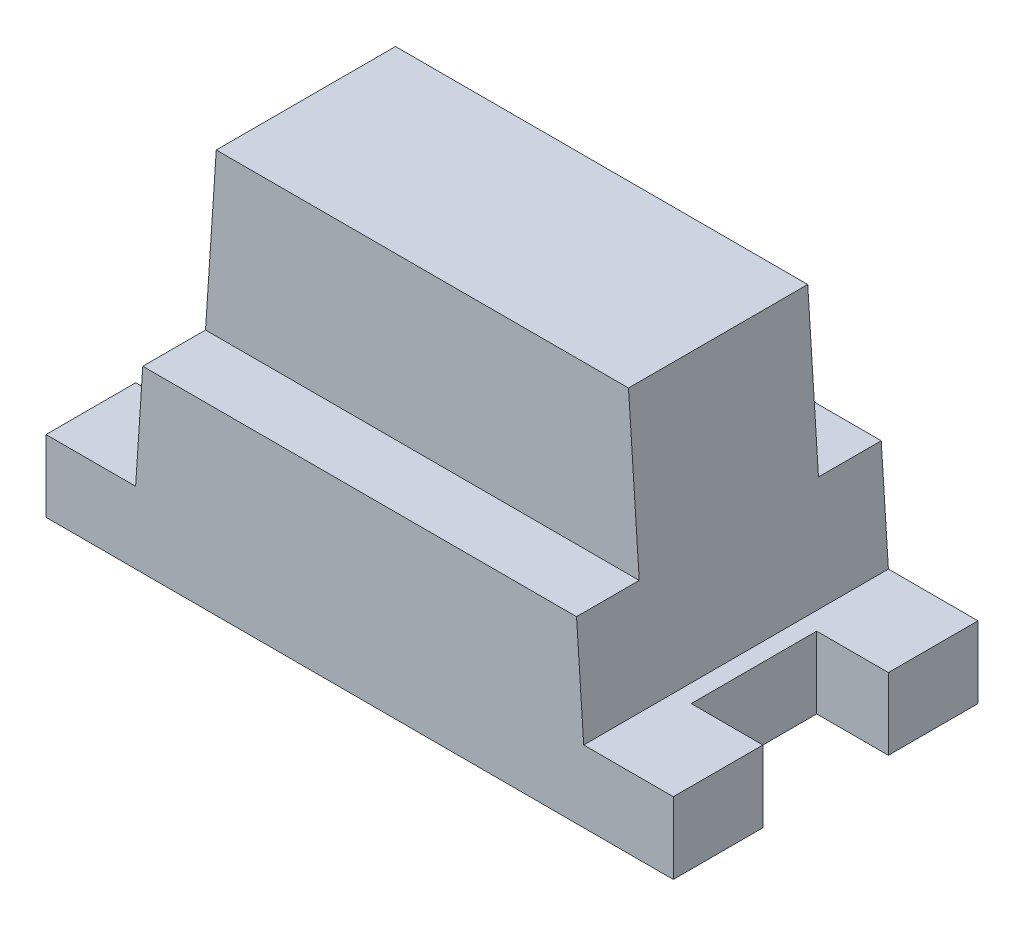
ISO-10303-21;
HEADER;
FILE_DESCRIPTION(('STEP AP214'),'2;1');
FILE_NAME('part.step','',(''),(''),'','','');
FILE_SCHEMA(('AUTOMOTIVE_DESIGN { 1 0 10303 214 1 1 1 1 }'));
ENDSEC;
DATA;
#1=APPLICATION_CONTEXT('core data for automotive mechanical design processes');
#2=APPLICATION_PROTOCOL_DEFINITION('international standard','automotive_design',2000,#1);
#3=PRODUCT_CONTEXT('',#1,'mechanical');
#4=PRODUCT('Part','Part','',(#3));
#5=PRODUCT_RELATED_PRODUCT_CATEGORY('part','',(#4));
#6=PRODUCT_DEFINITION_FORMATION('','',#4);
#7=PRODUCT_DEFINITION_CONTEXT('part definition',#1,'design');
#8=PRODUCT_DEFINITION('design','',#6,#7);
#9=PRODUCT_DEFINITION_SHAPE('','',#8);
#10=(LENGTH_UNIT() NAMED_UNIT(*) SI_UNIT(.MILLI.,.METRE.));
#11=(NAMED_UNIT(*) PLANE_ANGLE_UNIT() SI_UNIT($,.RADIAN.));
#12=(NAMED_UNIT(*) SI_UNIT($,.STERADIAN.) SOLID_ANGLE_UNIT());
#13=UNCERTAINTY_MEASURE_WITH_UNIT(LENGTH_MEASURE(1.E-05),#10,'distance_accuracy_value','');
#14=(GEOMETRIC_REPRESENTATION_CONTEXT(3) GLOBAL_UNCERTAINTY_ASSIGNED_CONTEXT((#13)) GLOBAL_UNIT_ASSIGNED_CONTEXT((#10,
#11,#12)) REPRESENTATION_CONTEXT('',''));
#15=CARTESIAN_POINT('',(0.,0.,0.));
#16=DIRECTION('',(0.,0.,1.));
#17=DIRECTION('',(1.,0.,0.));
#18=AXIS2_PLACEMENT_3D('',#15,#16,#17);
#19=CARTESIAN_POINT('',(-48.6631265428452,0.,-17.));
#20=DIRECTION('',(1.,0.,0.));
#21=DIRECTION('',(0.,1.,0.));
#22=AXIS2_PLACEMENT_3D('',#19,#20,#21);
#23=PLANE('',#22);
#24=DIRECTION('',(0.,0.,1.));
#25=VECTOR('',#24,1.);
#26=CARTESIAN_POINT('',(-48.6631265428453,-30.6823675718026,-17.));
#27=LINE('',#26,#25);
#28=CARTESIAN_POINT('',(-48.6631265428453,-30.6823675718026,-17.));
#29=VERTEX_POINT('',#28);
#30=CARTESIAN_POINT('',(-48.6631265428453,-30.6823675718026,-7.));
#31=VERTEX_POINT('',#30);
#32=EDGE_CURVE('E11',#29,#31,#27,.T.);
#33=ORIENTED_EDGE('',*,*,#32,.T.);
#34=DIRECTION('',(0.,-1.,0.));
#35=VECTOR('',#34,1.);
#36=CARTESIAN_POINT('',(-48.6631265428453,-22.6823675718026,-7.));
#37=LINE('',#36,#35);
#38=CARTESIAN_POINT('',(-48.6631265428453,-22.6823675718026,-7.));
#39=VERTEX_POINT('',#38);
#40=EDGE_CURVE('E186',#39,#31,#37,.T.);
#41=ORIENTED_EDGE('',*,*,#40,.F.);
#42=DIRECTION('',(0.,0.,1.));
#43=VECTOR('',#42,1.);
#44=CARTESIAN_POINT('',(-48.6631265428453,-22.6823675718026,-17.));
#45=LINE('',#44,#43);
#46=CARTESIAN_POINT('',(-48.6631265428453,-22.6823675718026,-17.));
#47=VERTEX_POINT('',#46);
#48=EDGE_CURVE('E355',#47,#39,#45,.T.);
#49=ORIENTED_EDGE('',*,*,#48,.F.);
#50=DIRECTION('',(0.,1.,0.));
#51=VECTOR('',#50,1.);
#52=CARTESIAN_POINT('',(-48.6631265428452,0.,-17.));
#53=LINE('',#52,#51);
#54=EDGE_CURVE('E351',#29,#47,#53,.T.);
#55=ORIENTED_EDGE('',*,*,#54,.F.);
#56=EDGE_LOOP('',(#33,#41,#49,#55));
#57=FACE_BOUND('',#56,.T.);
#58=ADVANCED_FACE('F41',(#57),#23,.F.);
#59=CARTESIAN_POINT('',(21.3368734571547,0.,-17.));
#60=DIRECTION('',(1.,0.,0.));
#61=DIRECTION('',(0.,0.,-1.));
#62=AXIS2_PLACEMENT_3D('',#59,#60,#61);
#63=PLANE('',#62);
#64=DIRECTION('',(0.,-1.,0.));
#65=VECTOR('',#64,1.);
#66=CARTESIAN_POINT('',(21.3368734571547,-30.6823675718026,7.));
#67=LINE('',#66,#65);
#68=CARTESIAN_POINT('',(21.3368734571547,-22.6823675718026,7.));
#69=VERTEX_POINT('',#68);
#70=CARTESIAN_POINT('',(21.3368734571547,-30.6823675718026,7.));
#71=VERTEX_POINT('',#70);
#72=EDGE_CURVE('E216',#69,#71,#67,.T.);
#73=ORIENTED_EDGE('',*,*,#72,.F.);
#74=DIRECTION('',(0.,0.,1.));
#75=VECTOR('',#74,1.);
#76=CARTESIAN_POINT('',(21.3368734571547,-22.6823675718026,-17.));
#77=LINE('',#76,#75);
#78=CARTESIAN_POINT('',(21.3368734571547,-22.6823675718026,17.));
#79=VERTEX_POINT('',#78);
#80=EDGE_CURVE('E378',#69,#79,#77,.T.);
#81=ORIENTED_EDGE('',*,*,#80,.T.);
#82=DIRECTION('',(0.,1.,0.));
#83=VECTOR('',#82,1.);
#84=CARTESIAN_POINT('',(21.3368734571547,0.,17.));
#85=LINE('',#84,#83);
#86=CARTESIAN_POINT('',(21.3368734571547,-30.6823675718026,17.));
#87=VERTEX_POINT('',#86);
#88=EDGE_CURVE('E297',#87,#79,#85,.T.);
#89=ORIENTED_EDGE('',*,*,#88,.F.);
#90=DIRECTION('',(0.,0.,1.));
#91=VECTOR('',#90,1.);
#92=CARTESIAN_POINT('',(21.3368734571547,-30.6823675718026,-17.));
#93=LINE('',#92,#91);
#94=EDGE_CURVE('E353',#71,#87,#93,.T.);
#95=ORIENTED_EDGE('',*,*,#94,.F.);
#96=EDGE_LOOP('',(#73,#81,#89,#95));
#97=FACE_BOUND('',#96,.T.);
#98=ADVANCED_FACE('F392',(#97),#63,.T.);
#99=CARTESIAN_POINT('',(0.,-10.6823675718026,-17.));
#100=DIRECTION('',(0.,-1.,0.));
#101=DIRECTION('',(0.,0.,-1.));
#102=AXIS2_PLACEMENT_3D('',#99,#100,#101);
#103=PLANE('',#102);
#104=DIRECTION('',(1.,0.,0.));
#105=VECTOR('',#104,1.);
#106=CARTESIAN_POINT('',(0.,-10.6823675718026,10.));
#107=LINE('',#106,#105);
#108=CARTESIAN_POINT('',(-37.8631265428453,-10.6823675718026,10.));
#109=VERTEX_POINT('',#108);
#110=CARTESIAN_POINT('',(10.5368734571547,-10.6823675718026,10.));
#111=VERTEX_POINT('',#110);
#112=EDGE_CURVE('E261',#109,#111,#107,.T.);
#113=ORIENTED_EDGE('',*,*,#112,.F.);
#114=DIRECTION('',(0.,0.,1.));
#115=VECTOR('',#114,1.);
#116=CARTESIAN_POINT('',(-37.8631265428453,-10.6823675718026,-17.));
#117=LINE('',#116,#115);
#118=CARTESIAN_POINT('',(-37.8631265428453,-10.6823675718026,17.));
#119=VERTEX_POINT('',#118);
#120=EDGE_CURVE('E367',#109,#119,#117,.T.);
#121=ORIENTED_EDGE('',*,*,#120,.T.);
#122=DIRECTION('',(1.,0.,0.));
#123=VECTOR('',#122,1.);
#124=CARTESIAN_POINT('',(0.,-10.6823675718026,17.));
#125=LINE('',#124,#123);
#126=CARTESIAN_POINT('',(10.5368734571547,-10.6823675718026,17.));
#127=VERTEX_POINT('',#126);
#128=EDGE_CURVE('E309',#119,#127,#125,.T.);
#129=ORIENTED_EDGE('',*,*,#128,.T.);
#130=DIRECTION('',(0.,0.,1.));
#131=VECTOR('',#130,1.);
#132=CARTESIAN_POINT('',(10.5368734571547,-10.6823675718026,-17.));
#133=LINE('',#132,#131);
#134=EDGE_CURVE('E372',#111,#127,#133,.T.);
#135=ORIENTED_EDGE('',*,*,#134,.F.);
#136=EDGE_LOOP('',(#113,#121,#129,#135));
#137=FACE_BOUND('',#136,.T.);
#138=ADVANCED_FACE('F414',(#137),#103,.F.);
#139=CARTESIAN_POINT('',(0.,-30.6823675718026,-17.));
#140=DIRECTION('',(0.,-1.,0.));
#141=DIRECTION('',(0.,0.,-1.));
#142=AXIS2_PLACEMENT_3D('',#139,#140,#141);
#143=PLANE('',#142);
#144=DIRECTION('',(-1.,0.,0.));
#145=VECTOR('',#144,1.);
#146=CARTESIAN_POINT('',(-40.6631265428453,-30.6823675718026,-7.));
#147=LINE('',#146,#145);
#148=CARTESIAN_POINT('',(-40.6631265428453,-30.6823675718026,-7.));
#149=VERTEX_POINT('',#148);
#150=EDGE_CURVE('E181',#149,#31,#147,.T.);
#151=ORIENTED_EDGE('',*,*,#150,.T.);
#152=ORIENTED_EDGE('',*,*,#32,.F.);
#153=DIRECTION('',(1.,0.,0.));
#154=VECTOR('',#153,1.);
#155=CARTESIAN_POINT('',(0.,-30.6823675718026,-17.));
#156=LINE('',#155,#154);
#157=CARTESIAN_POINT('',(21.3368734571547,-30.6823675718026,-17.));
#158=VERTEX_POINT('',#157);
#159=EDGE_CURVE('E325',#29,#158,#156,.T.);
#160=ORIENTED_EDGE('',*,*,#159,.T.);
#161=CARTESIAN_POINT('',(21.3368734571547,-30.6823675718026,-7.));
#162=VERTEX_POINT('',#161);
#163=EDGE_CURVE('E45',#158,#162,#93,.T.);
#164=ORIENTED_EDGE('',*,*,#163,.T.);
#165=DIRECTION('',(1.,0.,0.));
#166=VECTOR('',#165,1.);
#167=CARTESIAN_POINT('',(13.3368734571547,-30.6823675718026,-7.));
#168=LINE('',#167,#166);
#169=CARTESIAN_POINT('',(13.3368734571547,-30.6823675718026,-7.));
#170=VERTEX_POINT('',#169);
#171=EDGE_CURVE('E67',#170,#162,#168,.T.);
#172=ORIENTED_EDGE('',*,*,#171,.F.);
#173=DIRECTION('',(0.,0.,-1.));
#174=VECTOR('',#173,1.);
#175=CARTESIAN_POINT('',(13.3368734571547,-30.6823675718026,7.));
#176=LINE('',#175,#174);
#177=CARTESIAN_POINT('',(13.3368734571547,-30.6823675718026,7.));
#178=VERTEX_POINT('',#177);
#179=EDGE_CURVE('E227',#178,#170,#176,.T.);
#180=ORIENTED_EDGE('',*,*,#179,.F.);
#181=DIRECTION('',(1.,0.,0.));
#182=VECTOR('',#181,1.);
#183=CARTESIAN_POINT('',(13.3368734571547,-30.6823675718026,7.));
#184=LINE('',#183,#182);
#185=EDGE_CURVE('E240',#178,#71,#184,.T.);
#186=ORIENTED_EDGE('',*,*,#185,.T.);
#187=ORIENTED_EDGE('',*,*,#94,.T.);
#188=DIRECTION('',(1.,0.,0.));
#189=VECTOR('',#188,1.);
#190=CARTESIAN_POINT('',(0.,-30.6823675718026,17.));
#191=LINE('',#190,#189);
#192=CARTESIAN_POINT('',(-48.6631265428453,-30.6823675718026,17.));
#193=VERTEX_POINT('',#192);
#194=EDGE_CURVE('E291',#193,#87,#191,.T.);
#195=ORIENTED_EDGE('',*,*,#194,.F.);
#196=CARTESIAN_POINT('',(-48.6631265428453,-30.6823675718026,7.));
#197=VERTEX_POINT('',#196);
#198=EDGE_CURVE('E51',#197,#193,#27,.T.);
#199=ORIENTED_EDGE('',*,*,#198,.F.);
#200=DIRECTION('',(-1.,0.,0.));
#201=VECTOR('',#200,1.);
#202=CARTESIAN_POINT('',(-40.6631265428453,-30.6823675718026,7.));
#203=LINE('',#202,#201);
#204=CARTESIAN_POINT('',(-40.6631265428453,-30.6823675718026,7.));
#205=VERTEX_POINT('',#204);
#206=EDGE_CURVE('E190',#205,#197,#203,.T.);
#207=ORIENTED_EDGE('',*,*,#206,.F.);
#208=DIRECTION('',(0.,0.,1.));
#209=VECTOR('',#208,1.);
#210=CARTESIAN_POINT('',(-40.6631265428453,-30.6823675718026,-7.));
#211=LINE('',#210,#209);
#212=EDGE_CURVE('E194',#149,#205,#211,.T.);
#213=ORIENTED_EDGE('',*,*,#212,.F.);
#214=EDGE_LOOP('',(#151,#152,#160,#164,#172,#180,#186,#187,#195,#199,#207,#213));
#215=FACE_BOUND('',#214,.T.);
#216=ADVANCED_FACE('F43',(#215),#143,.T.);
#217=CARTESIAN_POINT('',(-48.6631265428453,-22.6823675718026,7.));
#218=VERTEX_POINT('',#217);
#219=CARTESIAN_POINT('',(-48.6631265428453,-22.6823675718026,17.));
#220=VERTEX_POINT('',#219);
#221=EDGE_CURVE('E359',#218,#220,#45,.T.);
#222=ORIENTED_EDGE('',*,*,#221,.F.);
#223=DIRECTION('',(0.,1.,0.));
#224=VECTOR('',#223,1.);
#225=CARTESIAN_POINT('',(-48.6631265428453,-22.6823675718026,7.));
#226=LINE('',#225,#224);
#227=EDGE_CURVE('E199',#197,#218,#226,.T.);
#228=ORIENTED_EDGE('',*,*,#227,.F.);
#229=ORIENTED_EDGE('',*,*,#198,.T.);
#230=DIRECTION('',(0.,1.,0.));
#231=VECTOR('',#230,1.);
#232=CARTESIAN_POINT('',(-48.6631265428452,0.,17.));
#233=LINE('',#232,#231);
#234=EDGE_CURVE('E321',#193,#220,#233,.T.);
#235=ORIENTED_EDGE('',*,*,#234,.T.);
#236=EDGE_LOOP('',(#222,#228,#229,#235));
#237=FACE_BOUND('',#236,.T.);
#238=ADVANCED_FACE('F400',(#237),#23,.F.);
#239=CARTESIAN_POINT('',(0.,-22.6823675718026,-17.));
#240=DIRECTION('',(0.,1.,0.));
#241=DIRECTION('',(0.,0.,1.));
#242=AXIS2_PLACEMENT_3D('',#239,#240,#241);
#243=PLANE('',#242);
#244=DIRECTION('',(-1.,0.,0.));
#245=VECTOR('',#244,1.);
#246=CARTESIAN_POINT('',(-40.6631265428453,-22.6823675718026,-7.));
#247=LINE('',#246,#245);
#248=CARTESIAN_POINT('',(-40.6631265428453,-22.6823675718026,-7.));
#249=VERTEX_POINT('',#248);
#250=EDGE_CURVE('E213',#249,#39,#247,.T.);
#251=ORIENTED_EDGE('',*,*,#250,.F.);
#252=DIRECTION('',(0.,0.,-1.));
#253=VECTOR('',#252,1.);
#254=CARTESIAN_POINT('',(-40.6631265428453,-22.6823675718026,-7.));
#255=LINE('',#254,#253);
#256=CARTESIAN_POINT('',(-40.6631265428453,-22.6823675718026,7.));
#257=VERTEX_POINT('',#256);
#258=EDGE_CURVE('E191',#257,#249,#255,.T.);
#259=ORIENTED_EDGE('',*,*,#258,.F.);
#260=DIRECTION('',(-1.,0.,0.));
#261=VECTOR('',#260,1.);
#262=CARTESIAN_POINT('',(-40.6631265428453,-22.6823675718026,7.));
#263=LINE('',#262,#261);
#264=EDGE_CURVE('E217',#257,#218,#263,.T.);
#265=ORIENTED_EDGE('',*,*,#264,.T.);
#266=ORIENTED_EDGE('',*,*,#221,.T.);
#267=DIRECTION('',(-1.,0.,0.));
#268=VECTOR('',#267,1.);
#269=CARTESIAN_POINT('',(0.,-22.6823675718026,17.));
#270=LINE('',#269,#268);
#271=CARTESIAN_POINT('',(-38.6631265428453,-22.6823675718026,17.));
#272=VERTEX_POINT('',#271);
#273=EDGE_CURVE('E317',#272,#220,#270,.T.);
#274=ORIENTED_EDGE('',*,*,#273,.F.);
#275=DIRECTION('',(0.,0.,1.));
#276=VECTOR('',#275,1.);
#277=CARTESIAN_POINT('',(-38.6631265428453,-22.6823675718026,-17.));
#278=LINE('',#277,#276);
#279=CARTESIAN_POINT('',(-38.6631265428453,-22.6823675718026,-17.));
#280=VERTEX_POINT('',#279);
#281=EDGE_CURVE('E360',#280,#272,#278,.T.);
#282=ORIENTED_EDGE('',*,*,#281,.F.);
#283=DIRECTION('',(-1.,0.,0.));
#284=VECTOR('',#283,1.);
#285=CARTESIAN_POINT('',(0.,-22.6823675718026,-17.));
#286=LINE('',#285,#284);
#287=EDGE_CURVE('E347',#280,#47,#286,.T.);
#288=ORIENTED_EDGE('',*,*,#287,.T.);
#289=ORIENTED_EDGE('',*,*,#48,.T.);
#290=EDGE_LOOP('',(#251,#259,#265,#266,#274,#282,#288,#289));
#291=FACE_BOUND('',#290,.T.);
#292=ADVANCED_FACE('F424',(#291),#243,.T.);
#293=CARTESIAN_POINT('',(-36.9865838874476,2.46577225916316,-17.));
#294=DIRECTION('',(0.997785157856609,-0.0665190105237735,0.));
#295=DIRECTION('',(0.0665190105237735,0.997785157856609,0.));
#296=AXIS2_PLACEMENT_3D('',#293,#294,#295);
#297=PLANE('',#296);
#298=ORIENTED_EDGE('',*,*,#281,.T.);
#299=DIRECTION('',(0.0665190105237735,0.997785157856609,0.));
#300=VECTOR('',#299,1.);
#301=CARTESIAN_POINT('',(-36.9865838874476,2.46577225916316,17.));
#302=LINE('',#301,#300);
#303=EDGE_CURVE('E313',#272,#119,#302,.T.);
#304=ORIENTED_EDGE('',*,*,#303,.T.);
#305=ORIENTED_EDGE('',*,*,#120,.F.);
#306=DIRECTION('',(0.0665190105237735,0.997785157856609,0.));
#307=VECTOR('',#306,1.);
#308=CARTESIAN_POINT('',(-36.9865838874476,2.46577225916316,10.));
#309=LINE('',#308,#307);
#310=CARTESIAN_POINT('',(-36.6631265428453,7.31763242819744,10.));
#311=VERTEX_POINT('',#310);
#312=EDGE_CURVE('E248',#109,#311,#309,.T.);
#313=ORIENTED_EDGE('',*,*,#312,.T.);
#314=DIRECTION('',(0.,0.,1.));
#315=VECTOR('',#314,1.);
#316=CARTESIAN_POINT('',(-36.6631265428453,7.31763242819744,-10.));
#317=LINE('',#316,#315);
#318=CARTESIAN_POINT('',(-36.6631265428453,7.31763242819744,-10.));
#319=VERTEX_POINT('',#318);
#320=EDGE_CURVE('E288',#319,#311,#317,.T.);
#321=ORIENTED_EDGE('',*,*,#320,.F.);
#322=DIRECTION('',(0.0665190105237735,0.997785157856609,0.));
#323=VECTOR('',#322,1.);
#324=CARTESIAN_POINT('',(-36.9865838874476,2.46577225916316,-10.));
#325=LINE('',#324,#323);
#326=CARTESIAN_POINT('',(-37.8631265428453,-10.6823675718026,-10.));
#327=VERTEX_POINT('',#326);
#328=EDGE_CURVE('E272',#327,#319,#325,.T.);
#329=ORIENTED_EDGE('',*,*,#328,.F.);
#330=CARTESIAN_POINT('',(-37.8631265428453,-10.6823675718026,-17.));
#331=VERTEX_POINT('',#330);
#332=EDGE_CURVE('E363',#331,#327,#117,.T.);
#333=ORIENTED_EDGE('',*,*,#332,.F.);
#334=DIRECTION('',(0.0665190105237735,0.997785157856609,0.));
#335=VECTOR('',#334,1.);
#336=CARTESIAN_POINT('',(-36.9865838874476,2.46577225916316,-17.));
#337=LINE('',#336,#335);
#338=EDGE_CURVE('E344',#280,#331,#337,.T.);
#339=ORIENTED_EDGE('',*,*,#338,.F.);
#340=EDGE_LOOP('',(#298,#304,#305,#313,#321,#329,#333,#339));
#341=FACE_BOUND('',#340,.T.);
#342=ADVANCED_FACE('F417',(#341),#297,.F.);
#343=ORIENTED_EDGE('',*,*,#332,.T.);
#344=DIRECTION('',(1.,0.,0.));
#345=VECTOR('',#344,1.);
#346=CARTESIAN_POINT('',(0.,-10.6823675718026,-10.));
#347=LINE('',#346,#345);
#348=CARTESIAN_POINT('',(10.5368734571547,-10.6823675718026,-10.));
#349=VERTEX_POINT('',#348);
#350=EDGE_CURVE('E276',#327,#349,#347,.T.);
#351=ORIENTED_EDGE('',*,*,#350,.T.);
#352=CARTESIAN_POINT('',(10.5368734571547,-10.6823675718026,-17.));
#353=VERTEX_POINT('',#352);
#354=EDGE_CURVE('E368',#353,#349,#133,.T.);
#355=ORIENTED_EDGE('',*,*,#354,.F.);
#356=DIRECTION('',(1.,0.,0.));
#357=VECTOR('',#356,1.);
#358=CARTESIAN_POINT('',(0.,-10.6823675718026,-17.));
#359=LINE('',#358,#357);
#360=EDGE_CURVE('E341',#331,#353,#359,.T.);
#361=ORIENTED_EDGE('',*,*,#360,.F.);
#362=EDGE_LOOP('',(#343,#351,#355,#361));
#363=FACE_BOUND('',#362,.T.);
#364=ADVANCED_FACE('F454',(#363),#103,.F.);
#365=CARTESIAN_POINT('',(9.78124342602997,0.65208289506867,-17.));
#366=DIRECTION('',(0.997785157856609,0.0665190105237744,0.));
#367=DIRECTION('',(-0.0665190105237744,0.997785157856609,0.));
#368=AXIS2_PLACEMENT_3D('',#365,#366,#367);
#369=PLANE('',#368);
#370=ORIENTED_EDGE('',*,*,#354,.T.);
#371=DIRECTION('',(-0.0665190105237744,0.997785157856609,0.));
#372=VECTOR('',#371,1.);
#373=CARTESIAN_POINT('',(9.78124342602997,0.65208289506867,-10.));
#374=LINE('',#373,#372);
#375=CARTESIAN_POINT('',(9.33687345715472,7.31763242819744,-10.));
#376=VERTEX_POINT('',#375);
#377=EDGE_CURVE('E280',#349,#376,#374,.T.);
#378=ORIENTED_EDGE('',*,*,#377,.T.);
#379=DIRECTION('',(0.,0.,1.));
#380=VECTOR('',#379,1.);
#381=CARTESIAN_POINT('',(9.33687345715472,7.31763242819744,-10.));
#382=LINE('',#381,#380);
#383=CARTESIAN_POINT('',(9.33687345715472,7.31763242819744,10.));
#384=VERTEX_POINT('',#383);
#385=EDGE_CURVE('E287',#376,#384,#382,.T.);
#386=ORIENTED_EDGE('',*,*,#385,.T.);
#387=DIRECTION('',(-0.0665190105237744,0.997785157856609,0.));
#388=VECTOR('',#387,1.);
#389=CARTESIAN_POINT('',(9.78124342602997,0.65208289506867,10.));
#390=LINE('',#389,#388);
#391=EDGE_CURVE('E264',#111,#384,#390,.T.);
#392=ORIENTED_EDGE('',*,*,#391,.F.);
#393=ORIENTED_EDGE('',*,*,#134,.T.);
#394=DIRECTION('',(-0.0665190105237744,0.997785157856609,0.));
#395=VECTOR('',#394,1.);
#396=CARTESIAN_POINT('',(9.78124342602997,0.65208289506867,17.));
#397=LINE('',#396,#395);
#398=CARTESIAN_POINT('',(11.3368734571547,-22.6823675718026,17.));
#399=VERTEX_POINT('',#398);
#400=EDGE_CURVE('E305',#399,#127,#397,.T.);
#401=ORIENTED_EDGE('',*,*,#400,.F.);
#402=DIRECTION('',(0.,0.,1.));
#403=VECTOR('',#402,1.);
#404=CARTESIAN_POINT('',(11.3368734571547,-22.6823675718026,-17.));
#405=LINE('',#404,#403);
#406=CARTESIAN_POINT('',(11.3368734571547,-22.6823675718026,-17.));
#407=VERTEX_POINT('',#406);
#408=EDGE_CURVE('E373',#407,#399,#405,.T.);
#409=ORIENTED_EDGE('',*,*,#408,.F.);
#410=DIRECTION('',(-0.0665190105237744,0.997785157856609,0.));
#411=VECTOR('',#410,1.);
#412=CARTESIAN_POINT('',(9.78124342602997,0.65208289506867,-17.));
#413=LINE('',#412,#411);
#414=EDGE_CURVE('E337',#407,#353,#413,.T.);
#415=ORIENTED_EDGE('',*,*,#414,.T.);
#416=EDGE_LOOP('',(#370,#378,#386,#392,#393,#401,#409,#415));
#417=FACE_BOUND('',#416,.T.);
#418=ADVANCED_FACE('F410',(#417),#369,.T.);
#419=CARTESIAN_POINT('',(0.,-22.6823675718026,-17.));
#420=DIRECTION('',(0.,1.,0.));
#421=DIRECTION('',(0.,0.,1.));
#422=AXIS2_PLACEMENT_3D('',#419,#420,#421);
#423=PLANE('',#422);
#424=DIRECTION('',(1.,0.,0.));
#425=VECTOR('',#424,1.);
#426=CARTESIAN_POINT('',(13.3368734571547,-22.6823675718026,7.));
#427=LINE('',#426,#425);
#428=CARTESIAN_POINT('',(13.3368734571547,-22.6823675718026,7.));
#429=VERTEX_POINT('',#428);
#430=EDGE_CURVE('E245',#429,#69,#427,.T.);
#431=ORIENTED_EDGE('',*,*,#430,.F.);
#432=DIRECTION('',(0.,0.,1.));
#433=VECTOR('',#432,1.);
#434=CARTESIAN_POINT('',(13.3368734571547,-22.6823675718026,7.));
#435=LINE('',#434,#433);
#436=CARTESIAN_POINT('',(13.3368734571547,-22.6823675718026,-7.));
#437=VERTEX_POINT('',#436);
#438=EDGE_CURVE('E236',#437,#429,#435,.T.);
#439=ORIENTED_EDGE('',*,*,#438,.F.);
#440=DIRECTION('',(1.,0.,0.));
#441=VECTOR('',#440,1.);
#442=CARTESIAN_POINT('',(13.3368734571547,-22.6823675718026,-7.));
#443=LINE('',#442,#441);
#444=CARTESIAN_POINT('',(21.3368734571547,-22.6823675718026,-7.));
#445=VERTEX_POINT('',#444);
#446=EDGE_CURVE('E249',#437,#445,#443,.T.);
#447=ORIENTED_EDGE('',*,*,#446,.T.);
#448=CARTESIAN_POINT('',(21.3368734571547,-22.6823675718026,-17.));
#449=VERTEX_POINT('',#448);
#450=EDGE_CURVE('E375',#449,#445,#77,.T.);
#451=ORIENTED_EDGE('',*,*,#450,.F.);
#452=DIRECTION('',(-1.,0.,0.));
#453=VECTOR('',#452,1.);
#454=CARTESIAN_POINT('',(0.,-22.6823675718026,-17.));
#455=LINE('',#454,#453);
#456=EDGE_CURVE('E333',#449,#407,#455,.T.);
#457=ORIENTED_EDGE('',*,*,#456,.T.);
#458=ORIENTED_EDGE('',*,*,#408,.T.);
#459=DIRECTION('',(-1.,0.,0.));
#460=VECTOR('',#459,1.);
#461=CARTESIAN_POINT('',(0.,-22.6823675718026,17.));
#462=LINE('',#461,#460);
#463=EDGE_CURVE('E301',#79,#399,#462,.T.);
#464=ORIENTED_EDGE('',*,*,#463,.F.);
#465=ORIENTED_EDGE('',*,*,#80,.F.);
#466=EDGE_LOOP('',(#431,#439,#447,#451,#457,#458,#464,#465));
#467=FACE_BOUND('',#466,.T.);
#468=ADVANCED_FACE('F465',(#467),#423,.T.);
#469=DIRECTION('',(0.,1.,0.));
#470=VECTOR('',#469,1.);
#471=CARTESIAN_POINT('',(21.3368734571547,-30.6823675718026,-7.));
#472=LINE('',#471,#470);
#473=EDGE_CURVE('E228',#162,#445,#472,.T.);
#474=ORIENTED_EDGE('',*,*,#473,.F.);
#475=ORIENTED_EDGE('',*,*,#163,.F.);
#476=DIRECTION('',(0.,1.,0.));
#477=VECTOR('',#476,1.);
#478=CARTESIAN_POINT('',(21.3368734571547,0.,-17.));
#479=LINE('',#478,#477);
#480=EDGE_CURVE('E329',#158,#449,#479,.T.);
#481=ORIENTED_EDGE('',*,*,#480,.T.);
#482=ORIENTED_EDGE('',*,*,#450,.T.);
#483=EDGE_LOOP('',(#474,#475,#481,#482));
#484=FACE_BOUND('',#483,.T.);
#485=ADVANCED_FACE('F442',(#484),#63,.T.);
#486=CARTESIAN_POINT('',(0.,0.,-17.));
#487=DIRECTION('',(0.,0.,1.));
#488=DIRECTION('',(1.,0.,0.));
#489=AXIS2_PLACEMENT_3D('',#486,#487,#488);
#490=PLANE('',#489);
#491=ORIENTED_EDGE('',*,*,#159,.F.);
#492=ORIENTED_EDGE('',*,*,#54,.T.);
#493=ORIENTED_EDGE('',*,*,#287,.F.);
#494=ORIENTED_EDGE('',*,*,#338,.T.);
#495=ORIENTED_EDGE('',*,*,#360,.T.);
#496=ORIENTED_EDGE('',*,*,#414,.F.);
#497=ORIENTED_EDGE('',*,*,#456,.F.);
#498=ORIENTED_EDGE('',*,*,#480,.F.);
#499=EDGE_LOOP('',(#491,#492,#493,#494,#495,#496,#497,#498));
#500=FACE_BOUND('',#499,.T.);
#501=ADVANCED_FACE('F476',(#500),#490,.F.);
#502=CARTESIAN_POINT('',(0.,0.,17.));
#503=DIRECTION('',(0.,0.,1.));
#504=DIRECTION('',(1.,0.,0.));
#505=AXIS2_PLACEMENT_3D('',#502,#503,#504);
#506=PLANE('',#505);
#507=ORIENTED_EDGE('',*,*,#194,.T.);
#508=ORIENTED_EDGE('',*,*,#88,.T.);
#509=ORIENTED_EDGE('',*,*,#463,.T.);
#510=ORIENTED_EDGE('',*,*,#400,.T.);
#511=ORIENTED_EDGE('',*,*,#128,.F.);
#512=ORIENTED_EDGE('',*,*,#303,.F.);
#513=ORIENTED_EDGE('',*,*,#273,.T.);
#514=ORIENTED_EDGE('',*,*,#234,.F.);
#515=EDGE_LOOP('',(#507,#508,#509,#510,#511,#512,#513,#514));
#516=FACE_BOUND('',#515,.T.);
#517=ADVANCED_FACE('F395',(#516),#506,.T.);
#518=CARTESIAN_POINT('',(0.,7.31763242819744,-10.));
#519=DIRECTION('',(0.,-1.,0.));
#520=DIRECTION('',(0.,0.,-1.));
#521=AXIS2_PLACEMENT_3D('',#518,#519,#520);
#522=PLANE('',#521);
#523=ORIENTED_EDGE('',*,*,#320,.T.);
#524=DIRECTION('',(1.,0.,0.));
#525=VECTOR('',#524,1.);
#526=CARTESIAN_POINT('',(0.,7.31763242819744,10.));
#527=LINE('',#526,#525);
#528=EDGE_CURVE('E268',#311,#384,#527,.T.);
#529=ORIENTED_EDGE('',*,*,#528,.T.);
#530=ORIENTED_EDGE('',*,*,#385,.F.);
#531=DIRECTION('',(1.,0.,0.));
#532=VECTOR('',#531,1.);
#533=CARTESIAN_POINT('',(0.,7.31763242819744,-10.));
#534=LINE('',#533,#532);
#535=EDGE_CURVE('E284',#319,#376,#534,.T.);
#536=ORIENTED_EDGE('',*,*,#535,.F.);
#537=EDGE_LOOP('',(#523,#529,#530,#536));
#538=FACE_BOUND('',#537,.T.);
#539=ADVANCED_FACE('F499',(#538),#522,.F.);
#540=CARTESIAN_POINT('',(0.,0.,-10.));
#541=DIRECTION('',(0.,0.,1.));
#542=DIRECTION('',(1.,0.,0.));
#543=AXIS2_PLACEMENT_3D('',#540,#541,#542);
#544=PLANE('',#543);
#545=ORIENTED_EDGE('',*,*,#328,.T.);
#546=ORIENTED_EDGE('',*,*,#535,.T.);
#547=ORIENTED_EDGE('',*,*,#377,.F.);
#548=ORIENTED_EDGE('',*,*,#350,.F.);
#549=EDGE_LOOP('',(#545,#546,#547,#548));
#550=FACE_BOUND('',#549,.T.);
#551=ADVANCED_FACE('F470',(#550),#544,.F.);
#552=CARTESIAN_POINT('',(0.,0.,10.));
#553=DIRECTION('',(0.,0.,1.));
#554=DIRECTION('',(1.,0.,0.));
#555=AXIS2_PLACEMENT_3D('',#552,#553,#554);
#556=PLANE('',#555);
#557=ORIENTED_EDGE('',*,*,#312,.F.);
#558=ORIENTED_EDGE('',*,*,#112,.T.);
#559=ORIENTED_EDGE('',*,*,#391,.T.);
#560=ORIENTED_EDGE('',*,*,#528,.F.);
#561=EDGE_LOOP('',(#557,#558,#559,#560));
#562=FACE_BOUND('',#561,.T.);
#563=ADVANCED_FACE('F486',(#562),#556,.T.);
#564=CARTESIAN_POINT('',(13.3368734571547,-30.6823675718026,7.));
#565=DIRECTION('',(0.,0.,1.));
#566=DIRECTION('',(0.,-1.,0.));
#567=AXIS2_PLACEMENT_3D('',#564,#565,#566);
#568=PLANE('',#567);
#569=ORIENTED_EDGE('',*,*,#72,.T.);
#570=ORIENTED_EDGE('',*,*,#185,.F.);
#571=DIRECTION('',(0.,-1.,0.));
#572=VECTOR('',#571,1.);
#573=CARTESIAN_POINT('',(13.3368734571547,-30.6823675718026,7.));
#574=LINE('',#573,#572);
#575=EDGE_CURVE('E223',#429,#178,#574,.T.);
#576=ORIENTED_EDGE('',*,*,#575,.F.);
#577=ORIENTED_EDGE('',*,*,#430,.T.);
#578=EDGE_LOOP('',(#569,#570,#576,#577));
#579=FACE_BOUND('',#578,.T.);
#580=ADVANCED_FACE('F484',(#579),#568,.F.);
#581=CARTESIAN_POINT('',(13.3368734571547,-30.6823675718026,-7.));
#582=DIRECTION('',(0.,0.,-1.));
#583=DIRECTION('',(-1.,0.,0.));
#584=AXIS2_PLACEMENT_3D('',#581,#582,#583);
#585=PLANE('',#584);
#586=ORIENTED_EDGE('',*,*,#473,.T.);
#587=ORIENTED_EDGE('',*,*,#446,.F.);
#588=DIRECTION('',(0.,1.,0.));
#589=VECTOR('',#588,1.);
#590=CARTESIAN_POINT('',(13.3368734571547,-30.6823675718026,-7.));
#591=LINE('',#590,#589);
#592=EDGE_CURVE('E232',#170,#437,#591,.T.);
#593=ORIENTED_EDGE('',*,*,#592,.F.);
#594=ORIENTED_EDGE('',*,*,#171,.T.);
#595=EDGE_LOOP('',(#586,#587,#593,#594));
#596=FACE_BOUND('',#595,.T.);
#597=ADVANCED_FACE('F481',(#596),#585,.F.);
#598=CARTESIAN_POINT('',(13.3368734571547,0.,0.));
#599=DIRECTION('',(-1.,0.,0.));
#600=DIRECTION('',(0.,0.,1.));
#601=AXIS2_PLACEMENT_3D('',#598,#599,#600);
#602=PLANE('',#601);
#603=ORIENTED_EDGE('',*,*,#575,.T.);
#604=ORIENTED_EDGE('',*,*,#179,.T.);
#605=ORIENTED_EDGE('',*,*,#592,.T.);
#606=ORIENTED_EDGE('',*,*,#438,.T.);
#607=EDGE_LOOP('',(#603,#604,#605,#606));
#608=FACE_BOUND('',#607,.T.);
#609=ADVANCED_FACE('F434',(#608),#602,.F.);
#610=CARTESIAN_POINT('',(-40.6631265428453,-22.6823675718026,-7.));
#611=DIRECTION('',(0.,0.,-1.));
#612=DIRECTION('',(0.,1.,0.));
#613=AXIS2_PLACEMENT_3D('',#610,#611,#612);
#614=PLANE('',#613);
#615=ORIENTED_EDGE('',*,*,#40,.T.);
#616=ORIENTED_EDGE('',*,*,#150,.F.);
#617=DIRECTION('',(0.,-1.,0.));
#618=VECTOR('',#617,1.);
#619=CARTESIAN_POINT('',(-40.6631265428453,-22.6823675718026,-7.));
#620=LINE('',#619,#618);
#621=EDGE_CURVE('E184',#249,#149,#620,.T.);
#622=ORIENTED_EDGE('',*,*,#621,.F.);
#623=ORIENTED_EDGE('',*,*,#250,.T.);
#624=EDGE_LOOP('',(#615,#616,#622,#623));
#625=FACE_BOUND('',#624,.T.);
#626=ADVANCED_FACE('F183',(#625),#614,.F.);
#627=CARTESIAN_POINT('',(-40.6631265428453,-22.6823675718026,7.));
#628=DIRECTION('',(0.,0.,1.));
#629=DIRECTION('',(1.,0.,0.));
#630=AXIS2_PLACEMENT_3D('',#627,#628,#629);
#631=PLANE('',#630);
#632=ORIENTED_EDGE('',*,*,#227,.T.);
#633=ORIENTED_EDGE('',*,*,#264,.F.);
#634=DIRECTION('',(0.,1.,0.));
#635=VECTOR('',#634,1.);
#636=CARTESIAN_POINT('',(-40.6631265428453,-22.6823675718026,7.));
#637=LINE('',#636,#635);
#638=EDGE_CURVE('E59',#205,#257,#637,.T.);
#639=ORIENTED_EDGE('',*,*,#638,.F.);
#640=ORIENTED_EDGE('',*,*,#206,.T.);
#641=EDGE_LOOP('',(#632,#633,#639,#640));
#642=FACE_BOUND('',#641,.T.);
#643=ADVANCED_FACE('F426',(#642),#631,.F.);
#644=CARTESIAN_POINT('',(-40.6631265428452,0.,0.));
#645=DIRECTION('',(-1.,0.,0.));
#646=DIRECTION('',(0.,-1.,0.));
#647=AXIS2_PLACEMENT_3D('',#644,#645,#646);
#648=PLANE('',#647);
#649=ORIENTED_EDGE('',*,*,#621,.T.);
#650=ORIENTED_EDGE('',*,*,#212,.T.);
#651=ORIENTED_EDGE('',*,*,#638,.T.);
#652=ORIENTED_EDGE('',*,*,#258,.T.);
#653=EDGE_LOOP('',(#649,#650,#651,#652));
#654=FACE_BOUND('',#653,.T.);
#655=ADVANCED_FACE('F193',(#654),#648,.T.);
#656=CLOSED_SHELL('',(#58,#98,#138,#216,#238,#292,#342,#364,#418,#468,#485,#501,#517,#539,#551,
#563,#580,#597,#609,#626,#643,#655));
#657=MANIFOLD_SOLID_BREP('B2',#656);
#658=ADVANCED_BREP_SHAPE_REPRESENTATION('',(#18,#657),#14);
#659=SHAPE_DEFINITION_REPRESENTATION(#9,#658);
ENDSEC;
END-ISO-10303-21;
